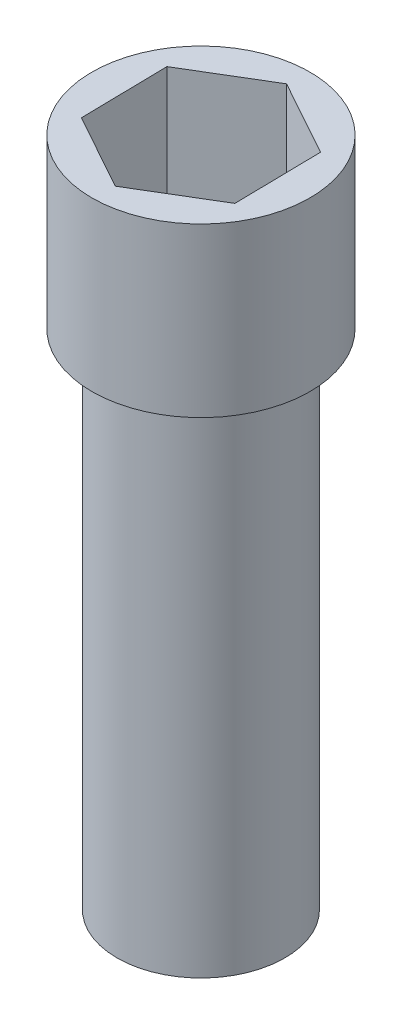
ISO-10303-21;
HEADER;
FILE_DESCRIPTION(('STEP AP214'),'2;1');
FILE_NAME('part.step','',(''),(''),'','','');
FILE_SCHEMA(('AUTOMOTIVE_DESIGN { 1 0 10303 214 1 1 1 1 }'));
ENDSEC;
DATA;
#1=APPLICATION_CONTEXT('core data for automotive mechanical design processes');
#2=APPLICATION_PROTOCOL_DEFINITION('international standard','automotive_design',2000,#1);
#3=PRODUCT_CONTEXT('',#1,'mechanical');
#4=PRODUCT('Part','Part','',(#3));
#5=PRODUCT_RELATED_PRODUCT_CATEGORY('part','',(#4));
#6=PRODUCT_DEFINITION_FORMATION('','',#4);
#7=PRODUCT_DEFINITION_CONTEXT('part definition',#1,'design');
#8=PRODUCT_DEFINITION('design','',#6,#7);
#9=PRODUCT_DEFINITION_SHAPE('','',#8);
#10=(LENGTH_UNIT() NAMED_UNIT(*) SI_UNIT(.MILLI.,.METRE.));
#11=(NAMED_UNIT(*) PLANE_ANGLE_UNIT() SI_UNIT($,.RADIAN.));
#12=(NAMED_UNIT(*) SI_UNIT($,.STERADIAN.) SOLID_ANGLE_UNIT());
#13=UNCERTAINTY_MEASURE_WITH_UNIT(LENGTH_MEASURE(1.E-05),#10,'distance_accuracy_value','');
#14=(GEOMETRIC_REPRESENTATION_CONTEXT(3) GLOBAL_UNCERTAINTY_ASSIGNED_CONTEXT((#13)) GLOBAL_UNIT_ASSIGNED_CONTEXT((#10,
#11,#12)) REPRESENTATION_CONTEXT('',''));
#15=CARTESIAN_POINT('',(0.,0.,0.));
#16=DIRECTION('',(0.,0.,1.));
#17=DIRECTION('',(1.,0.,0.));
#18=AXIS2_PLACEMENT_3D('',#15,#16,#17);
#19=CARTESIAN_POINT('',(0.,30.,0.));
#20=DIRECTION('',(0.,-1.,0.));
#21=DIRECTION('',(0.,0.,-1.));
#22=AXIS2_PLACEMENT_3D('',#19,#20,#21);
#23=CYLINDRICAL_SURFACE('',#22,5.);
#24=CARTESIAN_POINT('',(0.,30.,0.));
#25=DIRECTION('',(0.,1.,0.));
#26=DIRECTION('',(0.,0.,1.));
#27=AXIS2_PLACEMENT_3D('',#24,#25,#26);
#28=CIRCLE('',#27,5.);
#29=CARTESIAN_POINT('',(0.,30.,5.));
#30=VERTEX_POINT('',#29);
#31=EDGE_CURVE('E11',#30,#30,#28,.T.);
#32=ORIENTED_EDGE('',*,*,#31,.F.);
#33=EDGE_LOOP('',(#32));
#34=FACE_BOUND('',#33,.T.);
#35=CARTESIAN_POINT('',(0.,0.,0.));
#36=DIRECTION('',(0.,1.,0.));
#37=DIRECTION('',(0.,0.,1.));
#38=AXIS2_PLACEMENT_3D('',#35,#36,#37);
#39=CIRCLE('',#38,5.);
#40=CARTESIAN_POINT('',(0.,0.,5.));
#41=VERTEX_POINT('',#40);
#42=EDGE_CURVE('E47',#41,#41,#39,.T.);
#43=ORIENTED_EDGE('',*,*,#42,.T.);
#44=EDGE_LOOP('',(#43));
#45=FACE_BOUND('',#44,.T.);
#46=ADVANCED_FACE('F44',(#34,#45),#23,.T.);
#47=CARTESIAN_POINT('',(0.,0.,0.));
#48=DIRECTION('',(0.,1.,0.));
#49=DIRECTION('',(0.,0.,1.));
#50=AXIS2_PLACEMENT_3D('',#47,#48,#49);
#51=PLANE('',#50);
#52=ORIENTED_EDGE('',*,*,#42,.F.);
#53=EDGE_LOOP('',(#52));
#54=FACE_BOUND('',#53,.T.);
#55=ADVANCED_FACE('F195',(#54),#51,.F.);
#56=CARTESIAN_POINT('',(0.,40.,0.));
#57=DIRECTION('',(0.,-1.,0.));
#58=DIRECTION('',(0.,0.,-1.));
#59=AXIS2_PLACEMENT_3D('',#56,#57,#58);
#60=CYLINDRICAL_SURFACE('',#59,6.5);
#61=CARTESIAN_POINT('',(0.,40.,0.));
#62=DIRECTION('',(0.,1.,0.));
#63=DIRECTION('',(0.,0.,1.));
#64=AXIS2_PLACEMENT_3D('',#61,#62,#63);
#65=CIRCLE('',#64,6.5);
#66=CARTESIAN_POINT('',(0.,40.,6.5));
#67=VERTEX_POINT('',#66);
#68=EDGE_CURVE('E168',#67,#67,#65,.T.);
#69=ORIENTED_EDGE('',*,*,#68,.F.);
#70=EDGE_LOOP('',(#69));
#71=FACE_BOUND('',#70,.T.);
#72=CARTESIAN_POINT('',(0.,30.,0.));
#73=DIRECTION('',(0.,1.,0.));
#74=DIRECTION('',(0.,0.,1.));
#75=AXIS2_PLACEMENT_3D('',#72,#73,#74);
#76=CIRCLE('',#75,6.5);
#77=CARTESIAN_POINT('',(0.,30.,6.5));
#78=VERTEX_POINT('',#77);
#79=EDGE_CURVE('E158',#78,#78,#76,.T.);
#80=ORIENTED_EDGE('',*,*,#79,.T.);
#81=EDGE_LOOP('',(#80));
#82=FACE_BOUND('',#81,.T.);
#83=ADVANCED_FACE('F176',(#71,#82),#60,.T.);
#84=CARTESIAN_POINT('',(0.,40.,0.));
#85=DIRECTION('',(0.,1.,0.));
#86=DIRECTION('',(0.,0.,1.));
#87=AXIS2_PLACEMENT_3D('',#84,#85,#86);
#88=PLANE('',#87);
#89=DIRECTION('',(0.857190121928774,0.,-0.515000092104587));
#90=VECTOR('',#89,1.);
#91=CARTESIAN_POINT('',(0.0904551500804495,40.,5.19536503682118));
#92=LINE('',#91,#90);
#93=CARTESIAN_POINT('',(0.0904551500804495,40.,5.19536503682118));
#94=VERTEX_POINT('',#93);
#95=CARTESIAN_POINT('',(4.54454567886084,40.,2.51934606053779));
#96=VERTEX_POINT('',#95);
#97=EDGE_CURVE('E59',#94,#96,#92,.T.);
#98=ORIENTED_EDGE('',*,*,#97,.F.);
#99=DIRECTION('',(0.874598223678286,0.,0.484848375411105));
#100=VECTOR('',#99,1.);
#101=CARTESIAN_POINT('',(-4.45409052878039,40.,2.67601897628339));
#102=LINE('',#101,#100);
#103=CARTESIAN_POINT('',(-4.45409052878039,40.,2.67601897628339));
#104=VERTEX_POINT('',#103);
#105=EDGE_CURVE('E152',#104,#94,#102,.T.);
#106=ORIENTED_EDGE('',*,*,#105,.F.);
#107=DIRECTION('',(0.0174081017495115,0.,0.999848467515692));
#108=VECTOR('',#107,1.);
#109=CARTESIAN_POINT('',(-4.54454567886084,40.,-2.51934606053779));
#110=LINE('',#109,#108);
#111=CARTESIAN_POINT('',(-4.54454567886084,40.,-2.51934606053779));
#112=VERTEX_POINT('',#111);
#113=EDGE_CURVE('E149',#112,#104,#110,.T.);
#114=ORIENTED_EDGE('',*,*,#113,.F.);
#115=DIRECTION('',(-0.857190121928774,0.,0.515000092104587));
#116=VECTOR('',#115,1.);
#117=CARTESIAN_POINT('',(-0.0904551500804466,40.,-5.19536503682118));
#118=LINE('',#117,#116);
#119=CARTESIAN_POINT('',(-0.0904551500804466,40.,-5.19536503682118));
#120=VERTEX_POINT('',#119);
#121=EDGE_CURVE('E107',#120,#112,#118,.T.);
#122=ORIENTED_EDGE('',*,*,#121,.F.);
#123=DIRECTION('',(-0.874598223678285,0.,-0.484848375411105));
#124=VECTOR('',#123,1.);
#125=CARTESIAN_POINT('',(4.45409052878039,40.,-2.67601897628339));
#126=LINE('',#125,#124);
#127=CARTESIAN_POINT('',(4.45409052878039,40.,-2.67601897628339));
#128=VERTEX_POINT('',#127);
#129=EDGE_CURVE('E143',#128,#120,#126,.T.);
#130=ORIENTED_EDGE('',*,*,#129,.F.);
#131=DIRECTION('',(-0.0174081017495118,0.,-0.999848467515693));
#132=VECTOR('',#131,1.);
#133=CARTESIAN_POINT('',(4.54454567886084,40.,2.51934606053779));
#134=LINE('',#133,#132);
#135=EDGE_CURVE('E139',#96,#128,#134,.T.);
#136=ORIENTED_EDGE('',*,*,#135,.F.);
#137=EDGE_LOOP('',(#98,#106,#114,#122,#130,#136));
#138=FACE_BOUND('',#137,.T.);
#139=ORIENTED_EDGE('',*,*,#68,.T.);
#140=EDGE_LOOP('',(#139));
#141=FACE_BOUND('',#140,.T.);
#142=ADVANCED_FACE('F181',(#138,#141),#88,.T.);
#143=CARTESIAN_POINT('',(0.,30.,0.));
#144=DIRECTION('',(0.,1.,0.));
#145=DIRECTION('',(0.,0.,1.));
#146=AXIS2_PLACEMENT_3D('',#143,#144,#145);
#147=PLANE('',#146);
#148=ORIENTED_EDGE('',*,*,#31,.T.);
#149=EDGE_LOOP('',(#148));
#150=FACE_BOUND('',#149,.T.);
#151=ORIENTED_EDGE('',*,*,#79,.F.);
#152=EDGE_LOOP('',(#151));
#153=FACE_BOUND('',#152,.T.);
#154=ADVANCED_FACE('F178',(#150,#153),#147,.F.);
#155=CARTESIAN_POINT('',(0.0904551500804495,30.5,5.19536503682118));
#156=DIRECTION('',(0.515000092104587,0.,0.857190121928774));
#157=DIRECTION('',(0.857190121928774,0.,-0.515000092104587));
#158=AXIS2_PLACEMENT_3D('',#155,#156,#157);
#159=PLANE('',#158);
#160=ORIENTED_EDGE('',*,*,#97,.T.);
#161=DIRECTION('',(0.,1.,0.));
#162=VECTOR('',#161,1.);
#163=CARTESIAN_POINT('',(4.54454567886084,30.5,2.51934606053779));
#164=LINE('',#163,#162);
#165=CARTESIAN_POINT('',(4.54454567886084,30.5,2.51934606053779));
#166=VERTEX_POINT('',#165);
#167=EDGE_CURVE('E89',#166,#96,#164,.T.);
#168=ORIENTED_EDGE('',*,*,#167,.F.);
#169=DIRECTION('',(0.857190121928774,0.,-0.515000092104587));
#170=VECTOR('',#169,1.);
#171=CARTESIAN_POINT('',(0.0904551500804495,30.5,5.19536503682118));
#172=LINE('',#171,#170);
#173=CARTESIAN_POINT('',(0.0904551500804495,30.5,5.19536503682118));
#174=VERTEX_POINT('',#173);
#175=EDGE_CURVE('E155',#174,#166,#172,.T.);
#176=ORIENTED_EDGE('',*,*,#175,.F.);
#177=DIRECTION('',(0.,1.,0.));
#178=VECTOR('',#177,1.);
#179=CARTESIAN_POINT('',(0.0904551500804495,30.5,5.19536503682118));
#180=LINE('',#179,#178);
#181=EDGE_CURVE('E67',#174,#94,#180,.T.);
#182=ORIENTED_EDGE('',*,*,#181,.T.);
#183=EDGE_LOOP('',(#160,#168,#176,#182));
#184=FACE_BOUND('',#183,.T.);
#185=ADVANCED_FACE('F180',(#184),#159,.F.);
#186=CARTESIAN_POINT('',(-4.45409052878039,30.5,2.67601897628339));
#187=DIRECTION('',(-0.484848375411105,0.,0.874598223678285));
#188=DIRECTION('',(0.874598223678286,0.,0.484848375411105));
#189=AXIS2_PLACEMENT_3D('',#186,#187,#188);
#190=PLANE('',#189);
#191=ORIENTED_EDGE('',*,*,#105,.T.);
#192=ORIENTED_EDGE('',*,*,#181,.F.);
#193=DIRECTION('',(0.874598223678286,0.,0.484848375411105));
#194=VECTOR('',#193,1.);
#195=CARTESIAN_POINT('',(-4.45409052878039,30.5,2.67601897628339));
#196=LINE('',#195,#194);
#197=CARTESIAN_POINT('',(-4.45409052878039,30.5,2.67601897628339));
#198=VERTEX_POINT('',#197);
#199=EDGE_CURVE('E121',#198,#174,#196,.T.);
#200=ORIENTED_EDGE('',*,*,#199,.F.);
#201=DIRECTION('',(0.,1.,0.));
#202=VECTOR('',#201,1.);
#203=CARTESIAN_POINT('',(-4.45409052878039,30.5,2.67601897628339));
#204=LINE('',#203,#202);
#205=EDGE_CURVE('E112',#198,#104,#204,.T.);
#206=ORIENTED_EDGE('',*,*,#205,.T.);
#207=EDGE_LOOP('',(#191,#192,#200,#206));
#208=FACE_BOUND('',#207,.T.);
#209=ADVANCED_FACE('F189',(#208),#190,.F.);
#210=CARTESIAN_POINT('',(-4.54454567886084,30.5,-2.51934606053779));
#211=DIRECTION('',(-0.999848467515693,0.,0.0174081017495115));
#212=DIRECTION('',(0.0174081017495115,0.,0.999848467515693));
#213=AXIS2_PLACEMENT_3D('',#210,#211,#212);
#214=PLANE('',#213);
#215=ORIENTED_EDGE('',*,*,#113,.T.);
#216=ORIENTED_EDGE('',*,*,#205,.F.);
#217=DIRECTION('',(0.0174081017495115,0.,0.999848467515692));
#218=VECTOR('',#217,1.);
#219=CARTESIAN_POINT('',(-4.54454567886084,30.5,-2.51934606053779));
#220=LINE('',#219,#218);
#221=CARTESIAN_POINT('',(-4.54454567886084,30.5,-2.51934606053779));
#222=VERTEX_POINT('',#221);
#223=EDGE_CURVE('E116',#222,#198,#220,.T.);
#224=ORIENTED_EDGE('',*,*,#223,.F.);
#225=DIRECTION('',(0.,1.,0.));
#226=VECTOR('',#225,1.);
#227=CARTESIAN_POINT('',(-4.54454567886084,30.5,-2.51934606053779));
#228=LINE('',#227,#226);
#229=EDGE_CURVE('E100',#222,#112,#228,.T.);
#230=ORIENTED_EDGE('',*,*,#229,.T.);
#231=EDGE_LOOP('',(#215,#216,#224,#230));
#232=FACE_BOUND('',#231,.T.);
#233=ADVANCED_FACE('F117',(#232),#214,.F.);
#234=CARTESIAN_POINT('',(-0.0904551500804466,30.5,-5.19536503682118));
#235=DIRECTION('',(-0.515000092104587,0.,-0.857190121928774));
#236=DIRECTION('',(-0.857190121928774,0.,0.515000092104587));
#237=AXIS2_PLACEMENT_3D('',#234,#235,#236);
#238=PLANE('',#237);
#239=ORIENTED_EDGE('',*,*,#121,.T.);
#240=ORIENTED_EDGE('',*,*,#229,.F.);
#241=DIRECTION('',(-0.857190121928774,0.,0.515000092104587));
#242=VECTOR('',#241,1.);
#243=CARTESIAN_POINT('',(-0.0904551500804466,30.5,-5.19536503682118));
#244=LINE('',#243,#242);
#245=CARTESIAN_POINT('',(-0.0904551500804466,30.5,-5.19536503682118));
#246=VERTEX_POINT('',#245);
#247=EDGE_CURVE('E104',#246,#222,#244,.T.);
#248=ORIENTED_EDGE('',*,*,#247,.F.);
#249=DIRECTION('',(0.,1.,0.));
#250=VECTOR('',#249,1.);
#251=CARTESIAN_POINT('',(-0.0904551500804466,30.5,-5.19536503682118));
#252=LINE('',#251,#250);
#253=EDGE_CURVE('E113',#246,#120,#252,.T.);
#254=ORIENTED_EDGE('',*,*,#253,.T.);
#255=EDGE_LOOP('',(#239,#240,#248,#254));
#256=FACE_BOUND('',#255,.T.);
#257=ADVANCED_FACE('F102',(#256),#238,.F.);
#258=CARTESIAN_POINT('',(4.45409052878039,30.5,-2.67601897628339));
#259=DIRECTION('',(0.484848375411105,0.,-0.874598223678285));
#260=DIRECTION('',(-0.874598223678286,0.,-0.484848375411105));
#261=AXIS2_PLACEMENT_3D('',#258,#259,#260);
#262=PLANE('',#261);
#263=ORIENTED_EDGE('',*,*,#129,.T.);
#264=ORIENTED_EDGE('',*,*,#253,.F.);
#265=DIRECTION('',(-0.874598223678285,0.,-0.484848375411105));
#266=VECTOR('',#265,1.);
#267=CARTESIAN_POINT('',(4.45409052878039,30.5,-2.67601897628339));
#268=LINE('',#267,#266);
#269=CARTESIAN_POINT('',(4.45409052878039,30.5,-2.67601897628339));
#270=VERTEX_POINT('',#269);
#271=EDGE_CURVE('E127',#270,#246,#268,.T.);
#272=ORIENTED_EDGE('',*,*,#271,.F.);
#273=DIRECTION('',(0.,1.,0.));
#274=VECTOR('',#273,1.);
#275=CARTESIAN_POINT('',(4.45409052878039,30.5,-2.67601897628339));
#276=LINE('',#275,#274);
#277=EDGE_CURVE('E163',#270,#128,#276,.T.);
#278=ORIENTED_EDGE('',*,*,#277,.T.);
#279=EDGE_LOOP('',(#263,#264,#272,#278));
#280=FACE_BOUND('',#279,.T.);
#281=ADVANCED_FACE('F258',(#280),#262,.F.);
#282=CARTESIAN_POINT('',(4.54454567886084,30.5,2.51934606053779));
#283=DIRECTION('',(0.999848467515693,0.,-0.0174081017495118));
#284=DIRECTION('',(-0.0174081017495118,0.,-0.999848467515693));
#285=AXIS2_PLACEMENT_3D('',#282,#283,#284);
#286=PLANE('',#285);
#287=ORIENTED_EDGE('',*,*,#135,.T.);
#288=ORIENTED_EDGE('',*,*,#277,.F.);
#289=DIRECTION('',(-0.0174081017495118,0.,-0.999848467515693));
#290=VECTOR('',#289,1.);
#291=CARTESIAN_POINT('',(4.54454567886084,30.5,2.51934606053779));
#292=LINE('',#291,#290);
#293=EDGE_CURVE('E131',#166,#270,#292,.T.);
#294=ORIENTED_EDGE('',*,*,#293,.F.);
#295=ORIENTED_EDGE('',*,*,#167,.T.);
#296=EDGE_LOOP('',(#287,#288,#294,#295));
#297=FACE_BOUND('',#296,.T.);
#298=ADVANCED_FACE('F267',(#297),#286,.F.);
#299=CARTESIAN_POINT('',(0.,30.5,0.));
#300=DIRECTION('',(0.,1.,0.));
#301=DIRECTION('',(0.,0.,1.));
#302=AXIS2_PLACEMENT_3D('',#299,#300,#301);
#303=PLANE('',#302);
#304=ORIENTED_EDGE('',*,*,#175,.T.);
#305=ORIENTED_EDGE('',*,*,#293,.T.);
#306=ORIENTED_EDGE('',*,*,#271,.T.);
#307=ORIENTED_EDGE('',*,*,#247,.T.);
#308=ORIENTED_EDGE('',*,*,#223,.T.);
#309=ORIENTED_EDGE('',*,*,#199,.T.);
#310=EDGE_LOOP('',(#304,#305,#306,#307,#308,#309));
#311=FACE_BOUND('',#310,.T.);
#312=ADVANCED_FACE('F124',(#311),#303,.T.);
#313=CLOSED_SHELL('',(#46,#55,#83,#142,#154,#185,#209,#233,#257,#281,#298,#312));
#314=MANIFOLD_SOLID_BREP('B2',#313);
#315=ADVANCED_BREP_SHAPE_REPRESENTATION('',(#18,#314),#14);
#316=SHAPE_DEFINITION_REPRESENTATION(#9,#315);
ENDSEC;
END-ISO-10303-21;
